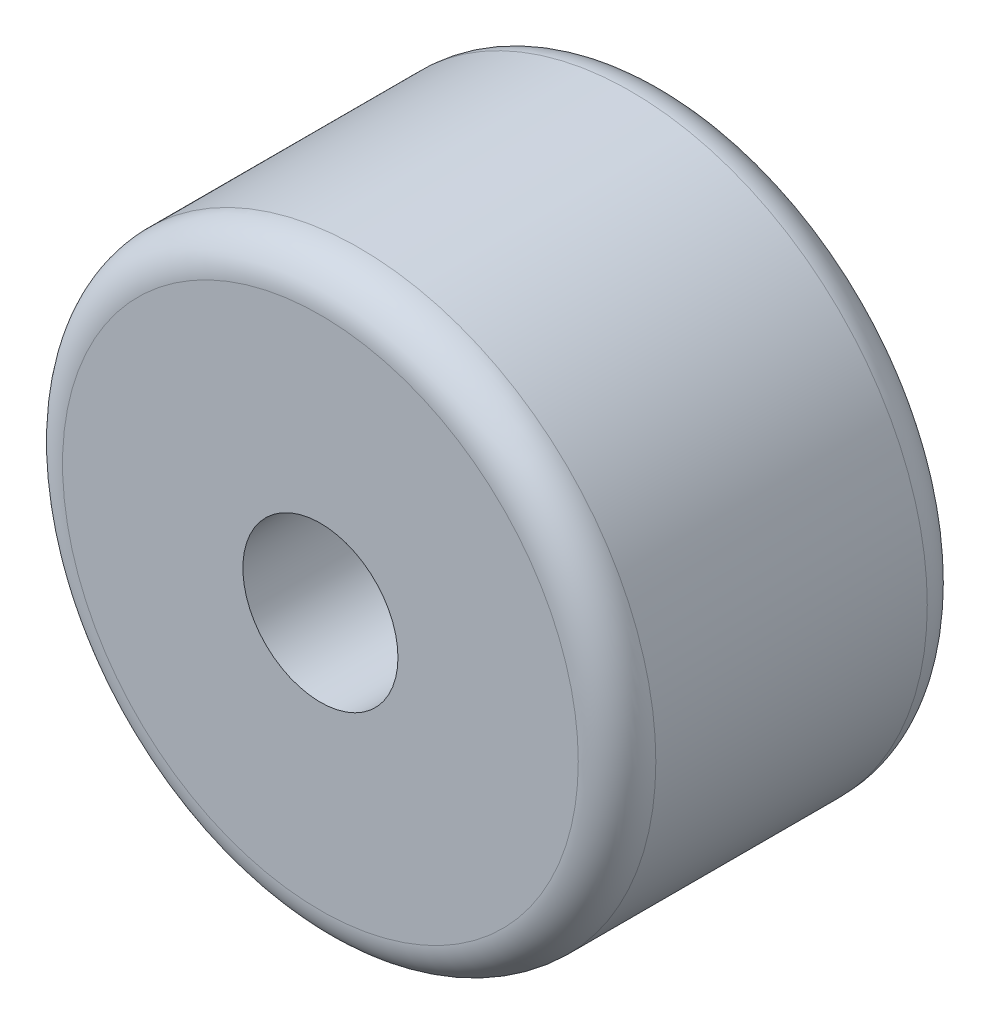
ISO-10303-21;
HEADER;
FILE_DESCRIPTION(('STEP AP214'),'2;1');
FILE_NAME('part.step','',(''),(''),'','','');
FILE_SCHEMA(('AUTOMOTIVE_DESIGN { 1 0 10303 214 1 1 1 1 }'));
ENDSEC;
DATA;
#1=APPLICATION_CONTEXT('core data for automotive mechanical design processes');
#2=APPLICATION_PROTOCOL_DEFINITION('international standard','automotive_design',2000,#1);
#3=PRODUCT_CONTEXT('',#1,'mechanical');
#4=PRODUCT('Part','Part','',(#3));
#5=PRODUCT_RELATED_PRODUCT_CATEGORY('part','',(#4));
#6=PRODUCT_DEFINITION_FORMATION('','',#4);
#7=PRODUCT_DEFINITION_CONTEXT('part definition',#1,'design');
#8=PRODUCT_DEFINITION('design','',#6,#7);
#9=PRODUCT_DEFINITION_SHAPE('','',#8);
#10=(LENGTH_UNIT() NAMED_UNIT(*) SI_UNIT(.MILLI.,.METRE.));
#11=(NAMED_UNIT(*) PLANE_ANGLE_UNIT() SI_UNIT($,.RADIAN.));
#12=(NAMED_UNIT(*) SI_UNIT($,.STERADIAN.) SOLID_ANGLE_UNIT());
#13=UNCERTAINTY_MEASURE_WITH_UNIT(LENGTH_MEASURE(1.E-05),#10,'distance_accuracy_value','');
#14=(GEOMETRIC_REPRESENTATION_CONTEXT(3) GLOBAL_UNCERTAINTY_ASSIGNED_CONTEXT((#13)) GLOBAL_UNIT_ASSIGNED_CONTEXT((#10,
#11,#12)) REPRESENTATION_CONTEXT('',''));
#15=CARTESIAN_POINT('',(0.,0.,0.));
#16=DIRECTION('',(0.,0.,1.));
#17=DIRECTION('',(1.,0.,0.));
#18=AXIS2_PLACEMENT_3D('',#15,#16,#17);
#19=CARTESIAN_POINT('',(0.,0.,9.));
#20=DIRECTION('',(0.,0.,-1.));
#21=DIRECTION('',(-1.,0.,0.));
#22=AXIS2_PLACEMENT_3D('',#19,#20,#21);
#23=CYLINDRICAL_SURFACE('',#22,7.65);
#24=CARTESIAN_POINT('',(0.,0.,0.999999999999999));
#25=DIRECTION('',(0.,0.,1.));
#26=DIRECTION('',(1.,0.,0.));
#27=AXIS2_PLACEMENT_3D('',#24,#25,#26);
#28=CIRCLE('',#27,7.65);
#29=CARTESIAN_POINT('',(7.65,0.,0.999999999999999));
#30=VERTEX_POINT('',#29);
#31=EDGE_CURVE('E42',#30,#30,#28,.T.);
#32=ORIENTED_EDGE('',*,*,#31,.T.);
#33=EDGE_LOOP('',(#32));
#34=FACE_BOUND('',#33,.T.);
#35=CARTESIAN_POINT('',(0.,0.,8.));
#36=DIRECTION('',(0.,0.,1.));
#37=DIRECTION('',(1.,0.,0.));
#38=AXIS2_PLACEMENT_3D('',#35,#36,#37);
#39=CIRCLE('',#38,7.65);
#40=CARTESIAN_POINT('',(7.65,0.,8.));
#41=VERTEX_POINT('',#40);
#42=EDGE_CURVE('E46',#41,#41,#39,.F.);
#43=ORIENTED_EDGE('',*,*,#42,.T.);
#44=EDGE_LOOP('',(#43));
#45=FACE_BOUND('',#44,.T.);
#46=ADVANCED_FACE('F31',(#34,#45),#23,.T.);
#47=CARTESIAN_POINT('',(0.,0.,9.));
#48=DIRECTION('',(0.,0.,1.));
#49=DIRECTION('',(1.,0.,0.));
#50=AXIS2_PLACEMENT_3D('',#47,#48,#49);
#51=PLANE('',#50);
#52=CARTESIAN_POINT('',(0.,0.,9.));
#53=DIRECTION('',(0.,0.,1.));
#54=DIRECTION('',(1.,0.,0.));
#55=AXIS2_PLACEMENT_3D('',#52,#53,#54);
#56=CIRCLE('',#55,6.65);
#57=CARTESIAN_POINT('',(6.65,0.,9.));
#58=VERTEX_POINT('',#57);
#59=EDGE_CURVE('E10',#58,#58,#56,.T.);
#60=ORIENTED_EDGE('',*,*,#59,.T.);
#61=EDGE_LOOP('',(#60));
#62=FACE_BOUND('',#61,.T.);
#63=CARTESIAN_POINT('',(0.,0.,9.));
#64=DIRECTION('',(0.,0.,1.));
#65=DIRECTION('',(1.,0.,0.));
#66=AXIS2_PLACEMENT_3D('',#63,#64,#65);
#67=CIRCLE('',#66,2.);
#68=CARTESIAN_POINT('',(2.,0.,9.));
#69=VERTEX_POINT('',#68);
#70=EDGE_CURVE('E52',#69,#69,#67,.T.);
#71=ORIENTED_EDGE('',*,*,#70,.F.);
#72=EDGE_LOOP('',(#71));
#73=FACE_BOUND('',#72,.T.);
#74=ADVANCED_FACE('F67',(#62,#73),#51,.T.);
#75=CARTESIAN_POINT('',(0.,0.,0.));
#76=DIRECTION('',(0.,0.,1.));
#77=DIRECTION('',(1.,0.,0.));
#78=AXIS2_PLACEMENT_3D('',#75,#76,#77);
#79=PLANE('',#78);
#80=CARTESIAN_POINT('',(0.,0.,0.));
#81=DIRECTION('',(0.,0.,1.));
#82=DIRECTION('',(1.,0.,0.));
#83=AXIS2_PLACEMENT_3D('',#80,#81,#82);
#84=CIRCLE('',#83,6.65);
#85=CARTESIAN_POINT('',(6.65,0.,0.));
#86=VERTEX_POINT('',#85);
#87=EDGE_CURVE('E38',#86,#86,#84,.F.);
#88=ORIENTED_EDGE('',*,*,#87,.T.);
#89=EDGE_LOOP('',(#88));
#90=FACE_BOUND('',#89,.T.);
#91=CARTESIAN_POINT('',(0.,0.,0.));
#92=DIRECTION('',(0.,0.,1.));
#93=DIRECTION('',(1.,0.,0.));
#94=AXIS2_PLACEMENT_3D('',#91,#92,#93);
#95=CIRCLE('',#94,2.);
#96=CARTESIAN_POINT('',(2.,0.,0.));
#97=VERTEX_POINT('',#96);
#98=EDGE_CURVE('E51',#97,#97,#95,.T.);
#99=ORIENTED_EDGE('',*,*,#98,.T.);
#100=EDGE_LOOP('',(#99));
#101=FACE_BOUND('',#100,.T.);
#102=ADVANCED_FACE('F58',(#90,#101),#79,.F.);
#103=CARTESIAN_POINT('',(0.,0.,0.));
#104=DIRECTION('',(0.,0.,1.));
#105=DIRECTION('',(1.,0.,0.));
#106=AXIS2_PLACEMENT_3D('',#103,#104,#105);
#107=CYLINDRICAL_SURFACE('',#106,2.);
#108=ORIENTED_EDGE('',*,*,#98,.F.);
#109=EDGE_LOOP('',(#108));
#110=FACE_BOUND('',#109,.T.);
#111=ORIENTED_EDGE('',*,*,#70,.T.);
#112=EDGE_LOOP('',(#111));
#113=FACE_BOUND('',#112,.T.);
#114=ADVANCED_FACE('F60',(#110,#113),#107,.F.);
#115=CARTESIAN_POINT('',(0.,0.,0.999999999999999));
#116=DIRECTION('',(0.,0.,1.));
#117=DIRECTION('',(1.,0.,0.));
#118=AXIS2_PLACEMENT_3D('',#115,#116,#117);
#119=TOROIDAL_SURFACE('',#118,6.65,1.);
#120=ORIENTED_EDGE('',*,*,#87,.F.);
#121=EDGE_LOOP('',(#120));
#122=FACE_BOUND('',#121,.T.);
#123=ORIENTED_EDGE('',*,*,#31,.F.);
#124=EDGE_LOOP('',(#123));
#125=FACE_BOUND('',#124,.T.);
#126=ADVANCED_FACE('F63',(#122,#125),#119,.T.);
#127=CARTESIAN_POINT('',(0.,0.,8.));
#128=DIRECTION('',(0.,0.,1.));
#129=DIRECTION('',(1.,0.,0.));
#130=AXIS2_PLACEMENT_3D('',#127,#128,#129);
#131=TOROIDAL_SURFACE('',#130,6.65,1.);
#132=ORIENTED_EDGE('',*,*,#42,.F.);
#133=EDGE_LOOP('',(#132));
#134=FACE_BOUND('',#133,.T.);
#135=ORIENTED_EDGE('',*,*,#59,.F.);
#136=EDGE_LOOP('',(#135));
#137=FACE_BOUND('',#136,.T.);
#138=ADVANCED_FACE('F33',(#134,#137),#131,.T.);
#139=CLOSED_SHELL('',(#46,#74,#102,#114,#126,#138));
#140=MANIFOLD_SOLID_BREP('B2',#139);
#141=ADVANCED_BREP_SHAPE_REPRESENTATION('',(#18,#140),#14);
#142=SHAPE_DEFINITION_REPRESENTATION(#9,#141);
ENDSEC;
END-ISO-10303-21;
